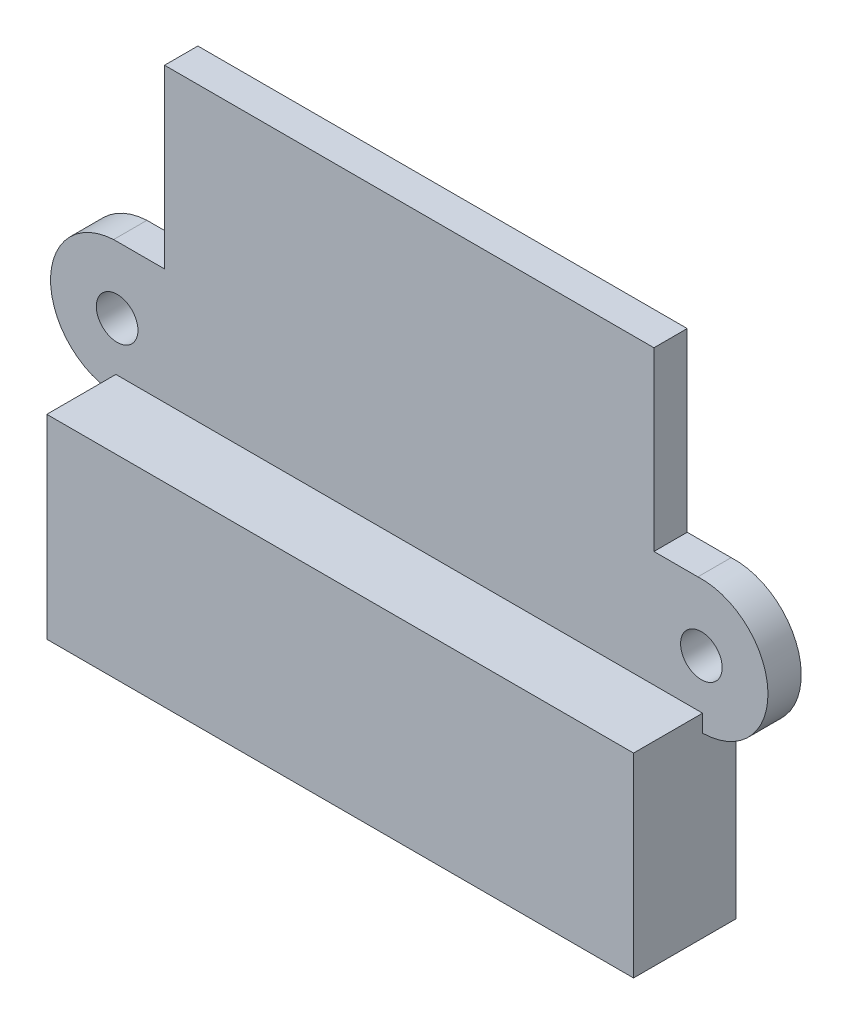
ISO-10303-21;
HEADER;
FILE_DESCRIPTION(('STEP AP214'),'2;1');
FILE_NAME('part.step','',(''),(''),'','','');
FILE_SCHEMA(('AUTOMOTIVE_DESIGN { 1 0 10303 214 1 1 1 1 }'));
ENDSEC;
DATA;
#1=APPLICATION_CONTEXT('core data for automotive mechanical design processes');
#2=APPLICATION_PROTOCOL_DEFINITION('international standard','automotive_design',2000,#1);
#3=PRODUCT_CONTEXT('',#1,'mechanical');
#4=PRODUCT('Part','Part','',(#3));
#5=PRODUCT_RELATED_PRODUCT_CATEGORY('part','',(#4));
#6=PRODUCT_DEFINITION_FORMATION('','',#4);
#7=PRODUCT_DEFINITION_CONTEXT('part definition',#1,'design');
#8=PRODUCT_DEFINITION('design','',#6,#7);
#9=PRODUCT_DEFINITION_SHAPE('','',#8);
#10=(LENGTH_UNIT() NAMED_UNIT(*) SI_UNIT(.MILLI.,.METRE.));
#11=(NAMED_UNIT(*) PLANE_ANGLE_UNIT() SI_UNIT($,.RADIAN.));
#12=(NAMED_UNIT(*) SI_UNIT($,.STERADIAN.) SOLID_ANGLE_UNIT());
#13=UNCERTAINTY_MEASURE_WITH_UNIT(LENGTH_MEASURE(1.E-05),#10,'distance_accuracy_value','');
#14=(GEOMETRIC_REPRESENTATION_CONTEXT(3) GLOBAL_UNCERTAINTY_ASSIGNED_CONTEXT((#13)) GLOBAL_UNIT_ASSIGNED_CONTEXT((#10,
#11,#12)) REPRESENTATION_CONTEXT('',''));
#15=CARTESIAN_POINT('',(0.,0.,0.));
#16=DIRECTION('',(0.,0.,1.));
#17=DIRECTION('',(1.,0.,0.));
#18=AXIS2_PLACEMENT_3D('',#15,#16,#17);
#19=CARTESIAN_POINT('',(8.9154,0.0165573963988308,1.016));
#20=DIRECTION('',(0.,0.,1.));
#21=DIRECTION('',(1.,0.,0.));
#22=AXIS2_PLACEMENT_3D('',#19,#20,#21);
#23=PLANE('',#22);
#24=DIRECTION('',(0.,-1.,0.));
#25=VECTOR('',#24,1.);
#26=CARTESIAN_POINT('',(-8.9535,-7.43055011809355,1.016));
#27=LINE('',#26,#25);
#28=CARTESIAN_POINT('',(-8.9535,-1.48484988190645,1.016));
#29=VERTEX_POINT('',#28);
#30=CARTESIAN_POINT('',(-8.9535,-2.01508538470222,1.016));
#31=VERTEX_POINT('',#30);
#32=EDGE_CURVE('E116',#29,#31,#27,.T.);
#33=ORIENTED_EDGE('',*,*,#32,.F.);
#34=DIRECTION('',(-1.,0.,0.));
#35=VECTOR('',#34,1.);
#36=CARTESIAN_POINT('',(-8.9535,-1.48484988190645,1.016));
#37=LINE('',#36,#35);
#38=CARTESIAN_POINT('',(8.9535,-1.48484988190645,1.016));
#39=VERTEX_POINT('',#38);
#40=EDGE_CURVE('E243',#39,#29,#37,.T.);
#41=ORIENTED_EDGE('',*,*,#40,.F.);
#42=DIRECTION('',(0.,1.,0.));
#43=VECTOR('',#42,1.);
#44=CARTESIAN_POINT('',(8.9535,-7.43055011809355,1.016));
#45=LINE('',#44,#43);
#46=CARTESIAN_POINT('',(8.9535,-2.01508538470222,1.016));
#47=VERTEX_POINT('',#46);
#48=EDGE_CURVE('E12',#47,#39,#45,.T.);
#49=ORIENTED_EDGE('',*,*,#48,.F.);
#50=CARTESIAN_POINT('',(8.9154,0.0165573963988308,1.016));
#51=DIRECTION('',(0.,0.,1.));
#52=DIRECTION('',(1.,0.,0.));
#53=AXIS2_PLACEMENT_3D('',#50,#51,#52);
#54=CIRCLE('',#53,2.032);
#55=CARTESIAN_POINT('',(8.80862501125642,2.04575011809355,1.016));
#56=VERTEX_POINT('',#55);
#57=EDGE_CURVE('E209',#47,#56,#54,.T.);
#58=ORIENTED_EDGE('',*,*,#57,.T.);
#59=DIRECTION('',(1.,0.,0.));
#60=VECTOR('',#59,1.);
#61=CARTESIAN_POINT('',(7.4676,2.04575011809355,1.016));
#62=LINE('',#61,#60);
#63=CARTESIAN_POINT('',(7.4676,2.04575011809355,1.016));
#64=VERTEX_POINT('',#63);
#65=EDGE_CURVE('E211',#64,#56,#62,.T.);
#66=ORIENTED_EDGE('',*,*,#65,.F.);
#67=DIRECTION('',(0.,-1.,0.));
#68=VECTOR('',#67,1.);
#69=CARTESIAN_POINT('',(7.4676,7.43055011809355,1.016));
#70=LINE('',#69,#68);
#71=CARTESIAN_POINT('',(7.4676,7.43055011809355,1.016));
#72=VERTEX_POINT('',#71);
#73=EDGE_CURVE('E261',#72,#64,#70,.T.);
#74=ORIENTED_EDGE('',*,*,#73,.F.);
#75=DIRECTION('',(1.,0.,0.));
#76=VECTOR('',#75,1.);
#77=CARTESIAN_POINT('',(-7.4676,7.43055011809355,1.016));
#78=LINE('',#77,#76);
#79=CARTESIAN_POINT('',(-7.4676,7.43055011809355,1.016));
#80=VERTEX_POINT('',#79);
#81=EDGE_CURVE('E259',#80,#72,#78,.T.);
#82=ORIENTED_EDGE('',*,*,#81,.F.);
#83=DIRECTION('',(0.,-1.,0.));
#84=VECTOR('',#83,1.);
#85=CARTESIAN_POINT('',(-7.4676,7.43055011809355,1.016));
#86=LINE('',#85,#84);
#87=CARTESIAN_POINT('',(-7.4676,2.04575011809355,1.016));
#88=VERTEX_POINT('',#87);
#89=EDGE_CURVE('E192',#80,#88,#86,.T.);
#90=ORIENTED_EDGE('',*,*,#89,.T.);
#91=DIRECTION('',(-1.,0.,0.));
#92=VECTOR('',#91,1.);
#93=CARTESIAN_POINT('',(-7.4676,2.04575011809355,1.016));
#94=LINE('',#93,#92);
#95=CARTESIAN_POINT('',(-9.02217498874351,2.04575011809355,1.016));
#96=VERTEX_POINT('',#95);
#97=EDGE_CURVE('E185',#88,#96,#94,.T.);
#98=ORIENTED_EDGE('',*,*,#97,.T.);
#99=CARTESIAN_POINT('',(-8.9154,0.0165573963988286,1.016));
#100=DIRECTION('',(0.,0.,1.));
#101=DIRECTION('',(1.,0.,0.));
#102=AXIS2_PLACEMENT_3D('',#99,#100,#101);
#103=CIRCLE('',#102,2.032);
#104=EDGE_CURVE('E189',#96,#31,#103,.T.);
#105=ORIENTED_EDGE('',*,*,#104,.T.);
#106=EDGE_LOOP('',(#33,#41,#49,#58,#66,#74,#82,#90,#98,#105));
#107=FACE_BOUND('',#106,.T.);
#108=CARTESIAN_POINT('',(-8.9154,0.0165573963988286,1.016));
#109=DIRECTION('',(0.,0.,1.));
#110=DIRECTION('',(1.,0.,0.));
#111=AXIS2_PLACEMENT_3D('',#108,#109,#110);
#112=CIRCLE('',#111,0.635000005703479);
#113=CARTESIAN_POINT('',(-8.28039999429652,0.0165573963988286,1.016));
#114=VERTEX_POINT('',#113);
#115=EDGE_CURVE('E253',#114,#114,#112,.T.);
#116=ORIENTED_EDGE('',*,*,#115,.F.);
#117=EDGE_LOOP('',(#116));
#118=FACE_BOUND('',#117,.T.);
#119=CARTESIAN_POINT('',(8.9154,0.0165573963988308,1.016));
#120=DIRECTION('',(0.,0.,1.));
#121=DIRECTION('',(1.,0.,0.));
#122=AXIS2_PLACEMENT_3D('',#119,#120,#121);
#123=CIRCLE('',#122,0.635000005703479);
#124=CARTESIAN_POINT('',(9.55040000570348,0.0165573963988308,1.016));
#125=VERTEX_POINT('',#124);
#126=EDGE_CURVE('E246',#125,#125,#123,.T.);
#127=ORIENTED_EDGE('',*,*,#126,.F.);
#128=EDGE_LOOP('',(#127));
#129=FACE_BOUND('',#128,.T.);
#130=ADVANCED_FACE('F99',(#107,#118,#129),#23,.T.);
#131=CARTESIAN_POINT('',(8.9154,0.0165573963988308,0.));
#132=DIRECTION('',(0.,0.,1.));
#133=DIRECTION('',(1.,0.,0.));
#134=AXIS2_PLACEMENT_3D('',#131,#132,#133);
#135=PLANE('',#134);
#136=CARTESIAN_POINT('',(-8.9154,0.0165573963988286,0.));
#137=DIRECTION('',(0.,0.,1.));
#138=DIRECTION('',(1.,0.,0.));
#139=AXIS2_PLACEMENT_3D('',#136,#137,#138);
#140=CIRCLE('',#139,0.635000005703479);
#141=CARTESIAN_POINT('',(-8.28039999429652,0.0165573963988286,0.));
#142=VERTEX_POINT('',#141);
#143=EDGE_CURVE('E249',#142,#142,#140,.T.);
#144=ORIENTED_EDGE('',*,*,#143,.T.);
#145=EDGE_LOOP('',(#144));
#146=FACE_BOUND('',#145,.T.);
#147=DIRECTION('',(1.,0.,0.));
#148=VECTOR('',#147,1.);
#149=CARTESIAN_POINT('',(-7.4676,7.43055011809355,0.));
#150=LINE('',#149,#148);
#151=CARTESIAN_POINT('',(-7.4676,7.43055011809355,0.));
#152=VERTEX_POINT('',#151);
#153=CARTESIAN_POINT('',(7.4676,7.43055011809355,0.));
#154=VERTEX_POINT('',#153);
#155=EDGE_CURVE('E256',#152,#154,#150,.T.);
#156=ORIENTED_EDGE('',*,*,#155,.T.);
#157=DIRECTION('',(0.,-1.,0.));
#158=VECTOR('',#157,1.);
#159=CARTESIAN_POINT('',(7.4676,7.43055011809355,0.));
#160=LINE('',#159,#158);
#161=CARTESIAN_POINT('',(7.4676,2.04575011809355,0.));
#162=VERTEX_POINT('',#161);
#163=EDGE_CURVE('E269',#154,#162,#160,.T.);
#164=ORIENTED_EDGE('',*,*,#163,.T.);
#165=DIRECTION('',(1.,0.,0.));
#166=VECTOR('',#165,1.);
#167=CARTESIAN_POINT('',(7.4676,2.04575011809355,0.));
#168=LINE('',#167,#166);
#169=CARTESIAN_POINT('',(8.80862501125642,2.04575011809355,0.));
#170=VERTEX_POINT('',#169);
#171=EDGE_CURVE('E272',#162,#170,#168,.T.);
#172=ORIENTED_EDGE('',*,*,#171,.T.);
#173=CARTESIAN_POINT('',(8.9154,0.0165573963988308,0.));
#174=DIRECTION('',(0.,0.,1.));
#175=DIRECTION('',(1.,0.,0.));
#176=AXIS2_PLACEMENT_3D('',#173,#174,#175);
#177=CIRCLE('',#176,2.032);
#178=CARTESIAN_POINT('',(8.9535,-2.01508538470222,0.));
#179=VERTEX_POINT('',#178);
#180=EDGE_CURVE('E275',#179,#170,#177,.T.);
#181=ORIENTED_EDGE('',*,*,#180,.F.);
#182=DIRECTION('',(0.,-1.,0.));
#183=VECTOR('',#182,1.);
#184=CARTESIAN_POINT('',(8.9535,-2.01508538470222,0.));
#185=LINE('',#184,#183);
#186=CARTESIAN_POINT('',(8.9535,-7.43055011809354,0.));
#187=VERTEX_POINT('',#186);
#188=EDGE_CURVE('E278',#179,#187,#185,.T.);
#189=ORIENTED_EDGE('',*,*,#188,.T.);
#190=DIRECTION('',(1.,0.,0.));
#191=VECTOR('',#190,1.);
#192=CARTESIAN_POINT('',(-8.9535,-7.43055011809355,0.));
#193=LINE('',#192,#191);
#194=CARTESIAN_POINT('',(-8.9535,-7.43055011809355,0.));
#195=VERTEX_POINT('',#194);
#196=EDGE_CURVE('E281',#195,#187,#193,.T.);
#197=ORIENTED_EDGE('',*,*,#196,.F.);
#198=DIRECTION('',(0.,-1.,0.));
#199=VECTOR('',#198,1.);
#200=CARTESIAN_POINT('',(-8.9535,-2.01508538470222,0.));
#201=LINE('',#200,#199);
#202=CARTESIAN_POINT('',(-8.9535,-2.01508538470222,0.));
#203=VERTEX_POINT('',#202);
#204=EDGE_CURVE('E283',#203,#195,#201,.T.);
#205=ORIENTED_EDGE('',*,*,#204,.F.);
#206=CARTESIAN_POINT('',(-8.9154,0.0165573963988286,0.));
#207=DIRECTION('',(0.,0.,1.));
#208=DIRECTION('',(1.,0.,0.));
#209=AXIS2_PLACEMENT_3D('',#206,#207,#208);
#210=CIRCLE('',#209,2.032);
#211=CARTESIAN_POINT('',(-9.02217498874351,2.04575011809355,0.));
#212=VERTEX_POINT('',#211);
#213=EDGE_CURVE('E285',#212,#203,#210,.T.);
#214=ORIENTED_EDGE('',*,*,#213,.F.);
#215=DIRECTION('',(-1.,0.,0.));
#216=VECTOR('',#215,1.);
#217=CARTESIAN_POINT('',(-7.4676,2.04575011809355,0.));
#218=LINE('',#217,#216);
#219=CARTESIAN_POINT('',(-7.4676,2.04575011809355,0.));
#220=VERTEX_POINT('',#219);
#221=EDGE_CURVE('E201',#220,#212,#218,.T.);
#222=ORIENTED_EDGE('',*,*,#221,.F.);
#223=DIRECTION('',(0.,-1.,0.));
#224=VECTOR('',#223,1.);
#225=CARTESIAN_POINT('',(-7.4676,7.43055011809355,0.));
#226=LINE('',#225,#224);
#227=EDGE_CURVE('E262',#152,#220,#226,.T.);
#228=ORIENTED_EDGE('',*,*,#227,.F.);
#229=EDGE_LOOP('',(#156,#164,#172,#181,#189,#197,#205,#214,#222,#228));
#230=FACE_BOUND('',#229,.T.);
#231=CARTESIAN_POINT('',(8.9154,0.0165573963988308,0.));
#232=DIRECTION('',(0.,0.,1.));
#233=DIRECTION('',(1.,0.,0.));
#234=AXIS2_PLACEMENT_3D('',#231,#232,#233);
#235=CIRCLE('',#234,0.635000005703479);
#236=CARTESIAN_POINT('',(9.55040000570348,0.0165573963988308,0.));
#237=VERTEX_POINT('',#236);
#238=EDGE_CURVE('E250',#237,#237,#235,.T.);
#239=ORIENTED_EDGE('',*,*,#238,.T.);
#240=EDGE_LOOP('',(#239));
#241=FACE_BOUND('',#240,.T.);
#242=ADVANCED_FACE('F290',(#146,#230,#241),#135,.F.);
#243=CARTESIAN_POINT('',(-7.4676,7.43055011809355,1.016));
#244=DIRECTION('',(0.,1.,0.));
#245=DIRECTION('',(0.,0.,1.));
#246=AXIS2_PLACEMENT_3D('',#243,#244,#245);
#247=PLANE('',#246);
#248=ORIENTED_EDGE('',*,*,#155,.F.);
#249=DIRECTION('',(0.,0.,-1.));
#250=VECTOR('',#249,1.);
#251=CARTESIAN_POINT('',(-7.4676,7.43055011809355,1.016));
#252=LINE('',#251,#250);
#253=EDGE_CURVE('E108',#80,#152,#252,.T.);
#254=ORIENTED_EDGE('',*,*,#253,.F.);
#255=ORIENTED_EDGE('',*,*,#81,.T.);
#256=DIRECTION('',(0.,0.,-1.));
#257=VECTOR('',#256,1.);
#258=CARTESIAN_POINT('',(7.4676,7.43055011809355,1.016));
#259=LINE('',#258,#257);
#260=EDGE_CURVE('E168',#72,#154,#259,.T.);
#261=ORIENTED_EDGE('',*,*,#260,.T.);
#262=EDGE_LOOP('',(#248,#254,#255,#261));
#263=FACE_BOUND('',#262,.T.);
#264=ADVANCED_FACE('F101',(#263),#247,.T.);
#265=CARTESIAN_POINT('',(-7.4676,7.43055011809355,1.016));
#266=DIRECTION('',(1.,0.,0.));
#267=DIRECTION('',(0.,1.,0.));
#268=AXIS2_PLACEMENT_3D('',#265,#266,#267);
#269=PLANE('',#268);
#270=ORIENTED_EDGE('',*,*,#227,.T.);
#271=DIRECTION('',(0.,0.,-1.));
#272=VECTOR('',#271,1.);
#273=CARTESIAN_POINT('',(-7.4676,2.04575011809355,1.016));
#274=LINE('',#273,#272);
#275=EDGE_CURVE('E204',#88,#220,#274,.T.);
#276=ORIENTED_EDGE('',*,*,#275,.F.);
#277=ORIENTED_EDGE('',*,*,#89,.F.);
#278=ORIENTED_EDGE('',*,*,#253,.T.);
#279=EDGE_LOOP('',(#270,#276,#277,#278));
#280=FACE_BOUND('',#279,.T.);
#281=ADVANCED_FACE('F341',(#280),#269,.F.);
#282=CARTESIAN_POINT('',(-7.4676,2.04575011809355,1.016));
#283=DIRECTION('',(0.,-1.,0.));
#284=DIRECTION('',(1.,0.,0.));
#285=AXIS2_PLACEMENT_3D('',#282,#283,#284);
#286=PLANE('',#285);
#287=ORIENTED_EDGE('',*,*,#221,.T.);
#288=DIRECTION('',(0.,0.,-1.));
#289=VECTOR('',#288,1.);
#290=CARTESIAN_POINT('',(-9.02217498874351,2.04575011809355,1.016));
#291=LINE('',#290,#289);
#292=EDGE_CURVE('E198',#96,#212,#291,.T.);
#293=ORIENTED_EDGE('',*,*,#292,.F.);
#294=ORIENTED_EDGE('',*,*,#97,.F.);
#295=ORIENTED_EDGE('',*,*,#275,.T.);
#296=EDGE_LOOP('',(#287,#293,#294,#295));
#297=FACE_BOUND('',#296,.T.);
#298=ADVANCED_FACE('F199',(#297),#286,.F.);
#299=CARTESIAN_POINT('',(-8.9154,0.0165573963988286,1.016));
#300=DIRECTION('',(0.,0.,-1.));
#301=DIRECTION('',(-1.,0.,0.));
#302=AXIS2_PLACEMENT_3D('',#299,#300,#301);
#303=CYLINDRICAL_SURFACE('',#302,2.032);
#304=ORIENTED_EDGE('',*,*,#213,.T.);
#305=DIRECTION('',(0.,0.,-1.));
#306=VECTOR('',#305,1.);
#307=CARTESIAN_POINT('',(-8.9535,-2.01508538470222,1.016));
#308=LINE('',#307,#306);
#309=EDGE_CURVE('E205',#31,#203,#308,.T.);
#310=ORIENTED_EDGE('',*,*,#309,.F.);
#311=ORIENTED_EDGE('',*,*,#104,.F.);
#312=ORIENTED_EDGE('',*,*,#292,.T.);
#313=EDGE_LOOP('',(#304,#310,#311,#312));
#314=FACE_BOUND('',#313,.T.);
#315=ADVANCED_FACE('F207',(#314),#303,.T.);
#316=CARTESIAN_POINT('',(-8.9535,-2.01508538470222,1.016));
#317=DIRECTION('',(1.,0.,0.));
#318=DIRECTION('',(0.,0.,-1.));
#319=AXIS2_PLACEMENT_3D('',#316,#317,#318);
#320=PLANE('',#319);
#321=ORIENTED_EDGE('',*,*,#204,.T.);
#322=DIRECTION('',(0.,0.,-1.));
#323=VECTOR('',#322,1.);
#324=CARTESIAN_POINT('',(-8.9535,-7.43055011809355,1.016));
#325=LINE('',#324,#323);
#326=CARTESIAN_POINT('',(-8.9535,-7.43055011809355,3.1242));
#327=VERTEX_POINT('',#326);
#328=EDGE_CURVE('E217',#327,#195,#325,.T.);
#329=ORIENTED_EDGE('',*,*,#328,.F.);
#330=DIRECTION('',(0.,-1.,0.));
#331=VECTOR('',#330,1.);
#332=CARTESIAN_POINT('',(-8.9535,-7.43055011809355,3.1242));
#333=LINE('',#332,#331);
#334=CARTESIAN_POINT('',(-8.9535,-1.48484988190645,3.1242));
#335=VERTEX_POINT('',#334);
#336=EDGE_CURVE('E297',#335,#327,#333,.T.);
#337=ORIENTED_EDGE('',*,*,#336,.F.);
#338=DIRECTION('',(0.,0.,-1.));
#339=VECTOR('',#338,1.);
#340=CARTESIAN_POINT('',(-8.9535,-1.48484988190645,3.1242));
#341=LINE('',#340,#339);
#342=EDGE_CURVE('E318',#335,#29,#341,.T.);
#343=ORIENTED_EDGE('',*,*,#342,.T.);
#344=ORIENTED_EDGE('',*,*,#32,.T.);
#345=ORIENTED_EDGE('',*,*,#309,.T.);
#346=EDGE_LOOP('',(#321,#329,#337,#343,#344,#345));
#347=FACE_BOUND('',#346,.T.);
#348=ADVANCED_FACE('F292',(#347),#320,.F.);
#349=CARTESIAN_POINT('',(-8.9535,-7.43055011809355,1.016));
#350=DIRECTION('',(0.,1.,0.));
#351=DIRECTION('',(-1.,0.,0.));
#352=AXIS2_PLACEMENT_3D('',#349,#350,#351);
#353=PLANE('',#352);
#354=ORIENTED_EDGE('',*,*,#196,.T.);
#355=DIRECTION('',(0.,0.,-1.));
#356=VECTOR('',#355,1.);
#357=CARTESIAN_POINT('',(8.9535,-7.43055011809354,1.016));
#358=LINE('',#357,#356);
#359=CARTESIAN_POINT('',(8.9535,-7.43055011809355,3.1242));
#360=VERTEX_POINT('',#359);
#361=EDGE_CURVE('E221',#360,#187,#358,.T.);
#362=ORIENTED_EDGE('',*,*,#361,.F.);
#363=DIRECTION('',(1.,0.,0.));
#364=VECTOR('',#363,1.);
#365=CARTESIAN_POINT('',(-8.9535,-7.43055011809355,3.1242));
#366=LINE('',#365,#364);
#367=EDGE_CURVE('E302',#327,#360,#366,.T.);
#368=ORIENTED_EDGE('',*,*,#367,.F.);
#369=ORIENTED_EDGE('',*,*,#328,.T.);
#370=EDGE_LOOP('',(#354,#362,#368,#369));
#371=FACE_BOUND('',#370,.T.);
#372=ADVANCED_FACE('F303',(#371),#353,.F.);
#373=CARTESIAN_POINT('',(8.9535,-2.01508538470222,1.016));
#374=DIRECTION('',(1.,0.,0.));
#375=DIRECTION('',(0.,1.,0.));
#376=AXIS2_PLACEMENT_3D('',#373,#374,#375);
#377=PLANE('',#376);
#378=ORIENTED_EDGE('',*,*,#188,.F.);
#379=DIRECTION('',(0.,0.,-1.));
#380=VECTOR('',#379,1.);
#381=CARTESIAN_POINT('',(8.9535,-2.01508538470222,1.016));
#382=LINE('',#381,#380);
#383=EDGE_CURVE('E228',#47,#179,#382,.T.);
#384=ORIENTED_EDGE('',*,*,#383,.F.);
#385=ORIENTED_EDGE('',*,*,#48,.T.);
#386=DIRECTION('',(0.,0.,-1.));
#387=VECTOR('',#386,1.);
#388=CARTESIAN_POINT('',(8.9535,-1.48484988190645,3.1242));
#389=LINE('',#388,#387);
#390=CARTESIAN_POINT('',(8.9535,-1.48484988190645,3.1242));
#391=VERTEX_POINT('',#390);
#392=EDGE_CURVE('E244',#391,#39,#389,.T.);
#393=ORIENTED_EDGE('',*,*,#392,.F.);
#394=DIRECTION('',(0.,1.,0.));
#395=VECTOR('',#394,1.);
#396=CARTESIAN_POINT('',(8.9535,-7.43055011809355,3.1242));
#397=LINE('',#396,#395);
#398=EDGE_CURVE('E307',#360,#391,#397,.T.);
#399=ORIENTED_EDGE('',*,*,#398,.F.);
#400=ORIENTED_EDGE('',*,*,#361,.T.);
#401=EDGE_LOOP('',(#378,#384,#385,#393,#399,#400));
#402=FACE_BOUND('',#401,.T.);
#403=ADVANCED_FACE('F326',(#402),#377,.T.);
#404=CARTESIAN_POINT('',(8.9154,0.0165573963988308,1.016));
#405=DIRECTION('',(0.,0.,-1.));
#406=DIRECTION('',(-1.,0.,0.));
#407=AXIS2_PLACEMENT_3D('',#404,#405,#406);
#408=CYLINDRICAL_SURFACE('',#407,2.032);
#409=ORIENTED_EDGE('',*,*,#180,.T.);
#410=DIRECTION('',(0.,0.,-1.));
#411=VECTOR('',#410,1.);
#412=CARTESIAN_POINT('',(8.80862501125642,2.04575011809355,1.016));
#413=LINE('',#412,#411);
#414=EDGE_CURVE('E232',#56,#170,#413,.T.);
#415=ORIENTED_EDGE('',*,*,#414,.F.);
#416=ORIENTED_EDGE('',*,*,#57,.F.);
#417=ORIENTED_EDGE('',*,*,#383,.T.);
#418=EDGE_LOOP('',(#409,#415,#416,#417));
#419=FACE_BOUND('',#418,.T.);
#420=ADVANCED_FACE('F334',(#419),#408,.T.);
#421=CARTESIAN_POINT('',(7.4676,2.04575011809355,1.016));
#422=DIRECTION('',(0.,1.,0.));
#423=DIRECTION('',(-1.,0.,0.));
#424=AXIS2_PLACEMENT_3D('',#421,#422,#423);
#425=PLANE('',#424);
#426=ORIENTED_EDGE('',*,*,#171,.F.);
#427=DIRECTION('',(0.,0.,-1.));
#428=VECTOR('',#427,1.);
#429=CARTESIAN_POINT('',(7.4676,2.04575011809355,1.016));
#430=LINE('',#429,#428);
#431=EDGE_CURVE('E234',#64,#162,#430,.T.);
#432=ORIENTED_EDGE('',*,*,#431,.F.);
#433=ORIENTED_EDGE('',*,*,#65,.T.);
#434=ORIENTED_EDGE('',*,*,#414,.T.);
#435=EDGE_LOOP('',(#426,#432,#433,#434));
#436=FACE_BOUND('',#435,.T.);
#437=ADVANCED_FACE('F338',(#436),#425,.T.);
#438=CARTESIAN_POINT('',(7.4676,7.43055011809355,1.016));
#439=DIRECTION('',(1.,0.,0.));
#440=DIRECTION('',(0.,1.,0.));
#441=AXIS2_PLACEMENT_3D('',#438,#439,#440);
#442=PLANE('',#441);
#443=ORIENTED_EDGE('',*,*,#163,.F.);
#444=ORIENTED_EDGE('',*,*,#260,.F.);
#445=ORIENTED_EDGE('',*,*,#73,.T.);
#446=ORIENTED_EDGE('',*,*,#431,.T.);
#447=EDGE_LOOP('',(#443,#444,#445,#446));
#448=FACE_BOUND('',#447,.T.);
#449=ADVANCED_FACE('F339',(#448),#442,.T.);
#450=CARTESIAN_POINT('',(-8.9154,0.0165573963988286,1.016));
#451=DIRECTION('',(0.,0.,-1.));
#452=DIRECTION('',(-1.,0.,0.));
#453=AXIS2_PLACEMENT_3D('',#450,#451,#452);
#454=CYLINDRICAL_SURFACE('',#453,0.635000005703479);
#455=ORIENTED_EDGE('',*,*,#115,.T.);
#456=EDGE_LOOP('',(#455));
#457=FACE_BOUND('',#456,.T.);
#458=ORIENTED_EDGE('',*,*,#143,.F.);
#459=EDGE_LOOP('',(#458));
#460=FACE_BOUND('',#459,.T.);
#461=ADVANCED_FACE('F356',(#457,#460),#454,.F.);
#462=CARTESIAN_POINT('',(8.9154,0.0165573963988308,1.016));
#463=DIRECTION('',(0.,0.,-1.));
#464=DIRECTION('',(-1.,0.,0.));
#465=AXIS2_PLACEMENT_3D('',#462,#463,#464);
#466=CYLINDRICAL_SURFACE('',#465,0.635000005703479);
#467=ORIENTED_EDGE('',*,*,#126,.T.);
#468=EDGE_LOOP('',(#467));
#469=FACE_BOUND('',#468,.T.);
#470=ORIENTED_EDGE('',*,*,#238,.F.);
#471=EDGE_LOOP('',(#470));
#472=FACE_BOUND('',#471,.T.);
#473=ADVANCED_FACE('F375',(#469,#472),#466,.F.);
#474=CARTESIAN_POINT('',(-8.9535,-1.48484988190645,3.1242));
#475=DIRECTION('',(0.,-1.,0.));
#476=DIRECTION('',(0.,0.,-1.));
#477=AXIS2_PLACEMENT_3D('',#474,#475,#476);
#478=PLANE('',#477);
#479=ORIENTED_EDGE('',*,*,#40,.T.);
#480=ORIENTED_EDGE('',*,*,#342,.F.);
#481=DIRECTION('',(-1.,0.,0.));
#482=VECTOR('',#481,1.);
#483=CARTESIAN_POINT('',(-8.9535,-1.48484988190645,3.1242));
#484=LINE('',#483,#482);
#485=EDGE_CURVE('E312',#391,#335,#484,.T.);
#486=ORIENTED_EDGE('',*,*,#485,.F.);
#487=ORIENTED_EDGE('',*,*,#392,.T.);
#488=EDGE_LOOP('',(#479,#480,#486,#487));
#489=FACE_BOUND('',#488,.T.);
#490=ADVANCED_FACE('F322',(#489),#478,.F.);
#491=CARTESIAN_POINT('',(0.,0.,3.1242));
#492=DIRECTION('',(0.,0.,-1.));
#493=DIRECTION('',(-1.,0.,0.));
#494=AXIS2_PLACEMENT_3D('',#491,#492,#493);
#495=PLANE('',#494);
#496=ORIENTED_EDGE('',*,*,#336,.T.);
#497=ORIENTED_EDGE('',*,*,#367,.T.);
#498=ORIENTED_EDGE('',*,*,#398,.T.);
#499=ORIENTED_EDGE('',*,*,#485,.T.);
#500=EDGE_LOOP('',(#496,#497,#498,#499));
#501=FACE_BOUND('',#500,.T.);
#502=ADVANCED_FACE('F310',(#501),#495,.F.);
#503=CLOSED_SHELL('',(#130,#242,#264,#281,#298,#315,#348,#372,#403,#420,#437,#449,#461,#473,
#490,#502));
#504=MANIFOLD_SOLID_BREP('B2',#503);
#505=ADVANCED_BREP_SHAPE_REPRESENTATION('',(#18,#504),#14);
#506=SHAPE_DEFINITION_REPRESENTATION(#9,#505);
ENDSEC;
END-ISO-10303-21;
